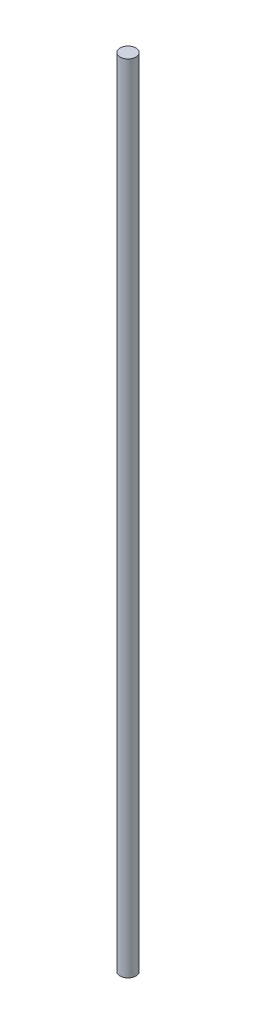
ISO-10303-21;
HEADER;
FILE_DESCRIPTION(('STEP AP214'),'2;1');
FILE_NAME('part.step','',(''),(''),'','','');
FILE_SCHEMA(('AUTOMOTIVE_DESIGN { 1 0 10303 214 1 1 1 1 }'));
ENDSEC;
DATA;
#1=APPLICATION_CONTEXT('core data for automotive mechanical design processes');
#2=APPLICATION_PROTOCOL_DEFINITION('international standard','automotive_design',2000,#1);
#3=PRODUCT_CONTEXT('',#1,'mechanical');
#4=PRODUCT('Part','Part','',(#3));
#5=PRODUCT_RELATED_PRODUCT_CATEGORY('part','',(#4));
#6=PRODUCT_DEFINITION_FORMATION('','',#4);
#7=PRODUCT_DEFINITION_CONTEXT('part definition',#1,'design');
#8=PRODUCT_DEFINITION('design','',#6,#7);
#9=PRODUCT_DEFINITION_SHAPE('','',#8);
#10=(LENGTH_UNIT() NAMED_UNIT(*) SI_UNIT(.MILLI.,.METRE.));
#11=(NAMED_UNIT(*) PLANE_ANGLE_UNIT() SI_UNIT($,.RADIAN.));
#12=(NAMED_UNIT(*) SI_UNIT($,.STERADIAN.) SOLID_ANGLE_UNIT());
#13=UNCERTAINTY_MEASURE_WITH_UNIT(LENGTH_MEASURE(1.E-05),#10,'distance_accuracy_value','');
#14=(GEOMETRIC_REPRESENTATION_CONTEXT(3) GLOBAL_UNCERTAINTY_ASSIGNED_CONTEXT((#13)) GLOBAL_UNIT_ASSIGNED_CONTEXT((#10,
#11,#12)) REPRESENTATION_CONTEXT('',''));
#15=CARTESIAN_POINT('',(0.,0.,0.));
#16=DIRECTION('',(0.,0.,1.));
#17=DIRECTION('',(1.,0.,0.));
#18=AXIS2_PLACEMENT_3D('',#15,#16,#17);
#19=CARTESIAN_POINT('',(0.,250.,0.));
#20=DIRECTION('',(0.,-1.,0.));
#21=DIRECTION('',(0.,0.,-1.));
#22=AXIS2_PLACEMENT_3D('',#19,#20,#21);
#23=CYLINDRICAL_SURFACE('',#22,2.5);
#24=CARTESIAN_POINT('',(0.,250.,0.));
#25=DIRECTION('',(0.,1.,0.));
#26=DIRECTION('',(0.,0.,1.));
#27=AXIS2_PLACEMENT_3D('',#24,#25,#26);
#28=CIRCLE('',#27,2.5);
#29=CARTESIAN_POINT('',(0.,250.,2.5));
#30=VERTEX_POINT('',#29);
#31=EDGE_CURVE('E10',#30,#30,#28,.T.);
#32=ORIENTED_EDGE('',*,*,#31,.F.);
#33=EDGE_LOOP('',(#32));
#34=FACE_BOUND('',#33,.T.);
#35=CARTESIAN_POINT('',(0.,0.,0.));
#36=DIRECTION('',(0.,1.,0.));
#37=DIRECTION('',(0.,0.,1.));
#38=AXIS2_PLACEMENT_3D('',#35,#36,#37);
#39=CIRCLE('',#38,2.5);
#40=CARTESIAN_POINT('',(0.,0.,2.5));
#41=VERTEX_POINT('',#40);
#42=EDGE_CURVE('E40',#41,#41,#39,.T.);
#43=ORIENTED_EDGE('',*,*,#42,.T.);
#44=EDGE_LOOP('',(#43));
#45=FACE_BOUND('',#44,.T.);
#46=ADVANCED_FACE('F37',(#34,#45),#23,.T.);
#47=CARTESIAN_POINT('',(0.,250.,0.));
#48=DIRECTION('',(0.,1.,0.));
#49=DIRECTION('',(0.,0.,1.));
#50=AXIS2_PLACEMENT_3D('',#47,#48,#49);
#51=PLANE('',#50);
#52=ORIENTED_EDGE('',*,*,#31,.T.);
#53=EDGE_LOOP('',(#52));
#54=FACE_BOUND('',#53,.T.);
#55=ADVANCED_FACE('F54',(#54),#51,.T.);
#56=CARTESIAN_POINT('',(0.,0.,0.));
#57=DIRECTION('',(0.,1.,0.));
#58=DIRECTION('',(0.,0.,1.));
#59=AXIS2_PLACEMENT_3D('',#56,#57,#58);
#60=PLANE('',#59);
#61=ORIENTED_EDGE('',*,*,#42,.F.);
#62=EDGE_LOOP('',(#61));
#63=FACE_BOUND('',#62,.T.);
#64=ADVANCED_FACE('F52',(#63),#60,.F.);
#65=CLOSED_SHELL('',(#46,#55,#64));
#66=MANIFOLD_SOLID_BREP('B2',#65);
#67=ADVANCED_BREP_SHAPE_REPRESENTATION('',(#18,#66),#14);
#68=SHAPE_DEFINITION_REPRESENTATION(#9,#67);
ENDSEC;
END-ISO-10303-21;
